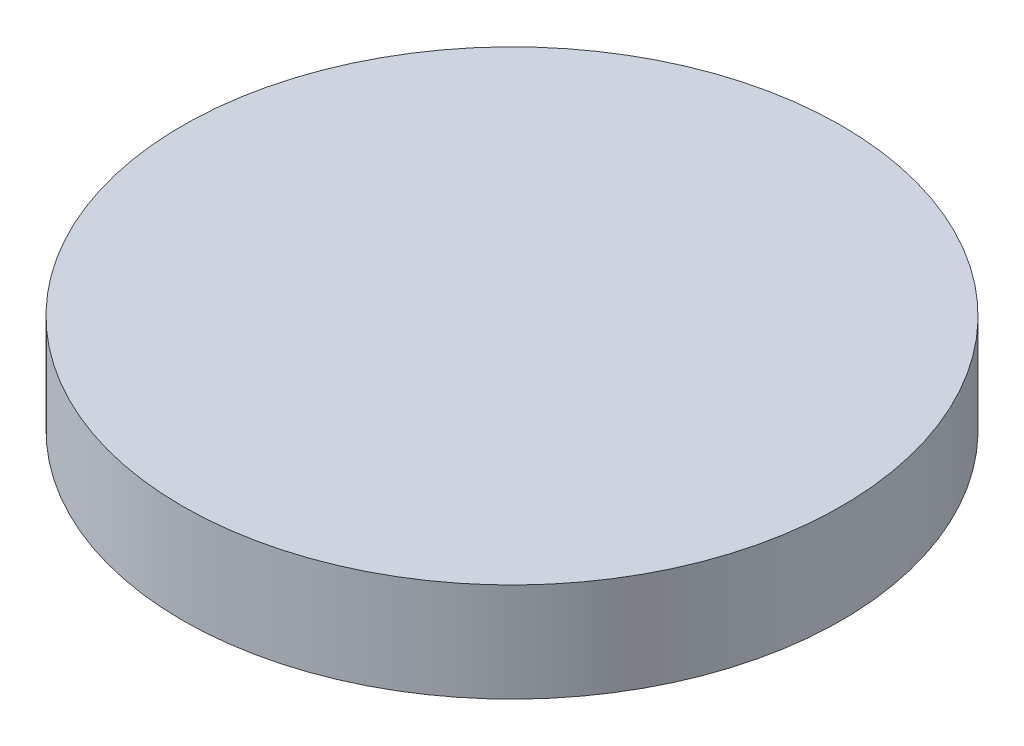
ISO-10303-21;
HEADER;
FILE_DESCRIPTION(('STEP AP214'),'2;1');
FILE_NAME('part.step','',(''),(''),'','','');
FILE_SCHEMA(('AUTOMOTIVE_DESIGN { 1 0 10303 214 1 1 1 1 }'));
ENDSEC;
DATA;
#1=APPLICATION_CONTEXT('core data for automotive mechanical design processes');
#2=APPLICATION_PROTOCOL_DEFINITION('international standard','automotive_design',2000,#1);
#3=PRODUCT_CONTEXT('',#1,'mechanical');
#4=PRODUCT('Part','Part','',(#3));
#5=PRODUCT_RELATED_PRODUCT_CATEGORY('part','',(#4));
#6=PRODUCT_DEFINITION_FORMATION('','',#4);
#7=PRODUCT_DEFINITION_CONTEXT('part definition',#1,'design');
#8=PRODUCT_DEFINITION('design','',#6,#7);
#9=PRODUCT_DEFINITION_SHAPE('','',#8);
#10=(LENGTH_UNIT() NAMED_UNIT(*) SI_UNIT(.MILLI.,.METRE.));
#11=(NAMED_UNIT(*) PLANE_ANGLE_UNIT() SI_UNIT($,.RADIAN.));
#12=(NAMED_UNIT(*) SI_UNIT($,.STERADIAN.) SOLID_ANGLE_UNIT());
#13=UNCERTAINTY_MEASURE_WITH_UNIT(LENGTH_MEASURE(1.E-05),#10,'distance_accuracy_value','');
#14=(GEOMETRIC_REPRESENTATION_CONTEXT(3) GLOBAL_UNCERTAINTY_ASSIGNED_CONTEXT((#13)) GLOBAL_UNIT_ASSIGNED_CONTEXT((#10,
#11,#12)) REPRESENTATION_CONTEXT('',''));
#15=CARTESIAN_POINT('',(0.,0.,0.));
#16=DIRECTION('',(0.,0.,1.));
#17=DIRECTION('',(1.,0.,0.));
#18=AXIS2_PLACEMENT_3D('',#15,#16,#17);
#19=CARTESIAN_POINT('',(0.,1.5,0.));
#20=DIRECTION('',(0.,-1.,0.));
#21=DIRECTION('',(0.,0.,-1.));
#22=AXIS2_PLACEMENT_3D('',#19,#20,#21);
#23=CYLINDRICAL_SURFACE('',#22,5.);
#24=CARTESIAN_POINT('',(0.,1.5,0.));
#25=DIRECTION('',(0.,1.,0.));
#26=DIRECTION('',(0.,0.,1.));
#27=AXIS2_PLACEMENT_3D('',#24,#25,#26);
#28=CIRCLE('',#27,5.);
#29=CARTESIAN_POINT('',(0.,1.5,5.));
#30=VERTEX_POINT('',#29);
#31=EDGE_CURVE('E10',#30,#30,#28,.T.);
#32=ORIENTED_EDGE('',*,*,#31,.F.);
#33=EDGE_LOOP('',(#32));
#34=FACE_BOUND('',#33,.T.);
#35=CARTESIAN_POINT('',(0.,0.,0.));
#36=DIRECTION('',(0.,1.,0.));
#37=DIRECTION('',(0.,0.,1.));
#38=AXIS2_PLACEMENT_3D('',#35,#36,#37);
#39=CIRCLE('',#38,5.);
#40=CARTESIAN_POINT('',(0.,0.,5.));
#41=VERTEX_POINT('',#40);
#42=EDGE_CURVE('E40',#41,#41,#39,.T.);
#43=ORIENTED_EDGE('',*,*,#42,.T.);
#44=EDGE_LOOP('',(#43));
#45=FACE_BOUND('',#44,.T.);
#46=ADVANCED_FACE('F37',(#34,#45),#23,.T.);
#47=CARTESIAN_POINT('',(0.,1.5,0.));
#48=DIRECTION('',(0.,1.,0.));
#49=DIRECTION('',(0.,0.,1.));
#50=AXIS2_PLACEMENT_3D('',#47,#48,#49);
#51=PLANE('',#50);
#52=ORIENTED_EDGE('',*,*,#31,.T.);
#53=EDGE_LOOP('',(#52));
#54=FACE_BOUND('',#53,.T.);
#55=ADVANCED_FACE('F52',(#54),#51,.T.);
#56=CARTESIAN_POINT('',(0.,0.,0.));
#57=DIRECTION('',(0.,1.,0.));
#58=DIRECTION('',(0.,0.,1.));
#59=AXIS2_PLACEMENT_3D('',#56,#57,#58);
#60=PLANE('',#59);
#61=ORIENTED_EDGE('',*,*,#42,.F.);
#62=EDGE_LOOP('',(#61));
#63=FACE_BOUND('',#62,.T.);
#64=ADVANCED_FACE('F50',(#63),#60,.F.);
#65=CLOSED_SHELL('',(#46,#55,#64));
#66=MANIFOLD_SOLID_BREP('B2',#65);
#67=ADVANCED_BREP_SHAPE_REPRESENTATION('',(#18,#66),#14);
#68=SHAPE_DEFINITION_REPRESENTATION(#9,#67);
ENDSEC;
END-ISO-10303-21;
